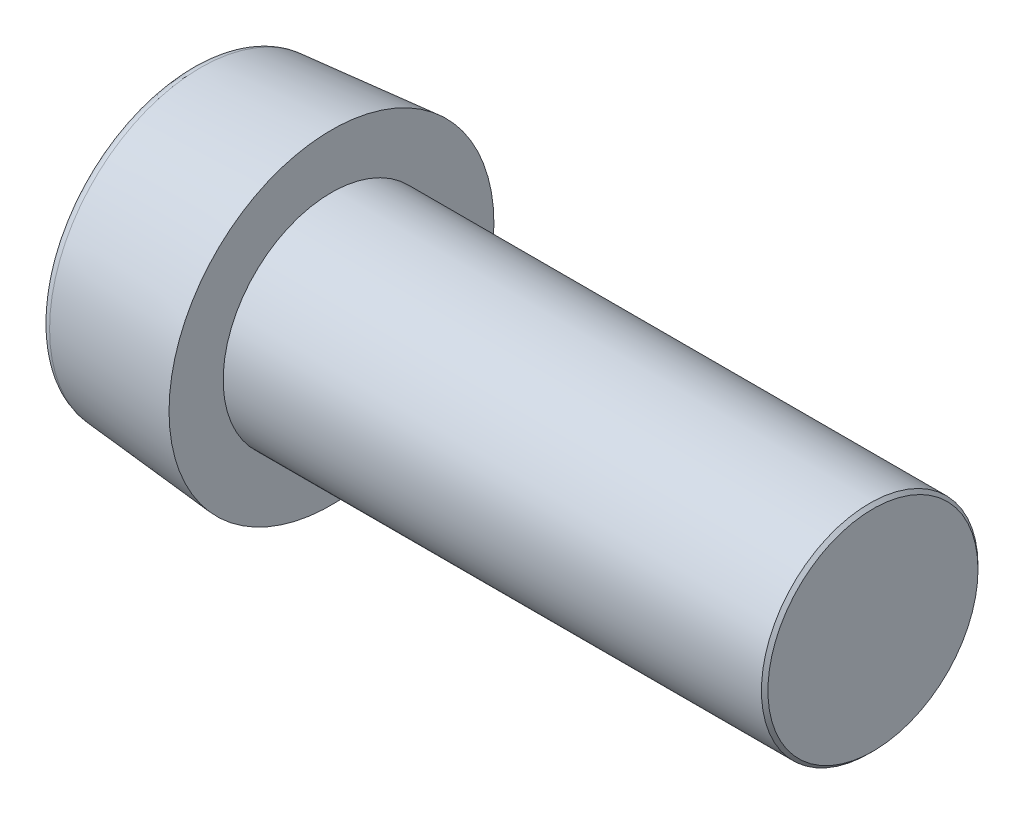
ISO-10303-21;
HEADER;
FILE_DESCRIPTION(('STEP AP214'),'2;1');
FILE_NAME('part.step','',(''),(''),'','','');
FILE_SCHEMA(('AUTOMOTIVE_DESIGN { 1 0 10303 214 1 1 1 1 }'));
ENDSEC;
DATA;
#1=APPLICATION_CONTEXT('core data for automotive mechanical design processes');
#2=APPLICATION_PROTOCOL_DEFINITION('international standard','automotive_design',2000,#1);
#3=PRODUCT_CONTEXT('',#1,'mechanical');
#4=PRODUCT('Part','Part','',(#3));
#5=PRODUCT_RELATED_PRODUCT_CATEGORY('part','',(#4));
#6=PRODUCT_DEFINITION_FORMATION('','',#4);
#7=PRODUCT_DEFINITION_CONTEXT('part definition',#1,'design');
#8=PRODUCT_DEFINITION('design','',#6,#7);
#9=PRODUCT_DEFINITION_SHAPE('','',#8);
#10=(LENGTH_UNIT() NAMED_UNIT(*) SI_UNIT(.MILLI.,.METRE.));
#11=(NAMED_UNIT(*) PLANE_ANGLE_UNIT() SI_UNIT($,.RADIAN.));
#12=(NAMED_UNIT(*) SI_UNIT($,.STERADIAN.) SOLID_ANGLE_UNIT());
#13=UNCERTAINTY_MEASURE_WITH_UNIT(LENGTH_MEASURE(1.E-05),#10,'distance_accuracy_value','');
#14=(GEOMETRIC_REPRESENTATION_CONTEXT(3) GLOBAL_UNCERTAINTY_ASSIGNED_CONTEXT((#13)) GLOBAL_UNIT_ASSIGNED_CONTEXT((#10,
#11,#12)) REPRESENTATION_CONTEXT('',''));
#15=CARTESIAN_POINT('',(0.,0.,0.));
#16=DIRECTION('',(0.,0.,1.));
#17=DIRECTION('',(1.,0.,0.));
#18=AXIS2_PLACEMENT_3D('',#15,#16,#17);
#19=CARTESIAN_POINT('',(-11.3282161267859,-3.48910775284139,-2.14278380347821));
#20=DIRECTION('',(1.,0.,0.));
#21=DIRECTION('',(0.,0.,-1.));
#22=AXIS2_PLACEMENT_3D('',#19,#20,#21);
#23=PLANE('',#22);
#24=CARTESIAN_POINT('',(-11.3282161267859,-3.48910775284139,-2.14278380347821));
#25=DIRECTION('',(1.,0.,0.));
#26=DIRECTION('',(0.,0.,-1.));
#27=AXIS2_PLACEMENT_3D('',#24,#25,#26);
#28=CIRCLE('',#27,12.9463162001456);
#29=CARTESIAN_POINT('',(-11.3282161267859,-3.48910775284139,-15.0891000036238));
#30=VERTEX_POINT('',#29);
#31=EDGE_CURVE('E113',#30,#30,#28,.F.);
#32=ORIENTED_EDGE('',*,*,#31,.T.);
#33=EDGE_LOOP('',(#32));
#34=FACE_BOUND('',#33,.T.);
#35=DIRECTION('',(0.,0.866025403784439,-0.5));
#36=VECTOR('',#35,1.);
#37=CARTESIAN_POINT('',(-11.3282161267859,-9.98910775284139,-5.89556055321078));
#38=LINE('',#37,#36);
#39=CARTESIAN_POINT('',(-11.3282161267859,-9.98910775284139,-5.89556055321078));
#40=VERTEX_POINT('',#39);
#41=CARTESIAN_POINT('',(-11.3282161267859,-3.48910775284139,-9.64833730294335));
#42=VERTEX_POINT('',#41);
#43=EDGE_CURVE('E33',#40,#42,#38,.T.);
#44=ORIENTED_EDGE('',*,*,#43,.T.);
#45=DIRECTION('',(0.,0.866025403784439,0.5));
#46=VECTOR('',#45,1.);
#47=CARTESIAN_POINT('',(-11.3282161267859,-3.48910775284139,-9.64833730294335));
#48=LINE('',#47,#46);
#49=CARTESIAN_POINT('',(-11.3282161267859,3.01089224715861,-5.89556055321078));
#50=VERTEX_POINT('',#49);
#51=EDGE_CURVE('E89',#42,#50,#48,.T.);
#52=ORIENTED_EDGE('',*,*,#51,.T.);
#53=DIRECTION('',(0.,0.,1.));
#54=VECTOR('',#53,1.);
#55=CARTESIAN_POINT('',(-11.3282161267859,3.01089224715861,-5.89556055321078));
#56=LINE('',#55,#54);
#57=CARTESIAN_POINT('',(-11.3282161267859,3.01089224715861,1.60999294625436));
#58=VERTEX_POINT('',#57);
#59=EDGE_CURVE('E86',#50,#58,#56,.T.);
#60=ORIENTED_EDGE('',*,*,#59,.T.);
#61=DIRECTION('',(0.,-0.866025403784438,0.5));
#62=VECTOR('',#61,1.);
#63=CARTESIAN_POINT('',(-11.3282161267859,3.01089224715861,1.60999294625436));
#64=LINE('',#63,#62);
#65=CARTESIAN_POINT('',(-11.3282161267859,-3.48910775284139,5.36276969598693));
#66=VERTEX_POINT('',#65);
#67=EDGE_CURVE('E66',#58,#66,#64,.T.);
#68=ORIENTED_EDGE('',*,*,#67,.T.);
#69=DIRECTION('',(0.,-0.866025403784438,-0.5));
#70=VECTOR('',#69,1.);
#71=CARTESIAN_POINT('',(-11.3282161267859,-3.48910775284139,5.36276969598693));
#72=LINE('',#71,#70);
#73=CARTESIAN_POINT('',(-11.3282161267859,-9.98910775284139,1.60999294625436));
#74=VERTEX_POINT('',#73);
#75=EDGE_CURVE('E77',#66,#74,#72,.T.);
#76=ORIENTED_EDGE('',*,*,#75,.T.);
#77=DIRECTION('',(0.,0.,-1.));
#78=VECTOR('',#77,1.);
#79=CARTESIAN_POINT('',(-11.3282161267859,-9.98910775284139,1.60999294625436));
#80=LINE('',#79,#78);
#81=EDGE_CURVE('E81',#74,#40,#80,.T.);
#82=ORIENTED_EDGE('',*,*,#81,.T.);
#83=EDGE_LOOP('',(#44,#52,#60,#68,#76,#82));
#84=FACE_BOUND('',#83,.T.);
#85=ADVANCED_FACE('F16',(#34,#84),#23,.F.);
#86=CARTESIAN_POINT('',(1.6717838732141,-3.48910775284139,-2.14278380347821));
#87=DIRECTION('',(1.,0.,0.));
#88=DIRECTION('',(0.,0.,-1.));
#89=AXIS2_PLACEMENT_3D('',#86,#87,#88);
#90=PLANE('',#89);
#91=CARTESIAN_POINT('',(1.6717838732141,-3.48910775284139,-2.14278380347821));
#92=DIRECTION('',(1.,0.,0.));
#93=DIRECTION('',(0.,0.,-1.));
#94=AXIS2_PLACEMENT_3D('',#91,#92,#93);
#95=CIRCLE('',#94,15.);
#96=CARTESIAN_POINT('',(1.6717838732141,-3.48910775284139,-17.1427838034782));
#97=VERTEX_POINT('',#96);
#98=EDGE_CURVE('E107',#97,#97,#95,.T.);
#99=ORIENTED_EDGE('',*,*,#98,.T.);
#100=EDGE_LOOP('',(#99));
#101=FACE_BOUND('',#100,.T.);
#102=CARTESIAN_POINT('',(1.6717838732141,-3.48910775284139,-2.14278380347821));
#103=DIRECTION('',(1.,0.,0.));
#104=DIRECTION('',(0.,0.,-1.));
#105=AXIS2_PLACEMENT_3D('',#102,#103,#104);
#106=CIRCLE('',#105,10.);
#107=CARTESIAN_POINT('',(1.6717838732141,-3.48910775284139,-12.1427838034782));
#108=VERTEX_POINT('',#107);
#109=EDGE_CURVE('E104',#108,#108,#106,.T.);
#110=ORIENTED_EDGE('',*,*,#109,.F.);
#111=EDGE_LOOP('',(#110));
#112=FACE_BOUND('',#111,.T.);
#113=ADVANCED_FACE('F132',(#101,#112),#90,.T.);
#114=CARTESIAN_POINT('',(1.6717838732141,-3.48910775284139,-2.14278380347821));
#115=DIRECTION('',(1.,0.,0.));
#116=DIRECTION('',(0.,0.,-1.));
#117=AXIS2_PLACEMENT_3D('',#114,#115,#116);
#118=CONICAL_SURFACE('',#117,15.,0.0872664625997167);
#119=CARTESIAN_POINT('',(-10.4153718695336,-3.48910775284139,-2.14278380347821));
#120=DIRECTION('',(1.,0.,0.));
#121=DIRECTION('',(0.,0.,-1.));
#122=AXIS2_PLACEMENT_3D('',#119,#120,#121);
#123=CIRCLE('',#122,13.9425108982373);
#124=CARTESIAN_POINT('',(-10.4153718695336,-3.48910775284139,-16.0852947017155));
#125=VERTEX_POINT('',#124);
#126=EDGE_CURVE('E115',#125,#125,#123,.T.);
#127=ORIENTED_EDGE('',*,*,#126,.T.);
#128=EDGE_LOOP('',(#127));
#129=FACE_BOUND('',#128,.T.);
#130=ORIENTED_EDGE('',*,*,#98,.F.);
#131=EDGE_LOOP('',(#130));
#132=FACE_BOUND('',#131,.T.);
#133=ADVANCED_FACE('F136',(#129,#132),#118,.T.);
#134=CARTESIAN_POINT('',(51.6717838732141,-3.48910775284139,-2.14278380347821));
#135=DIRECTION('',(-1.,0.,0.));
#136=DIRECTION('',(0.,0.,1.));
#137=AXIS2_PLACEMENT_3D('',#134,#135,#136);
#138=CYLINDRICAL_SURFACE('',#137,10.);
#139=CARTESIAN_POINT('',(51.3717838732141,-3.48910775284139,-2.14278380347821));
#140=DIRECTION('',(1.,0.,0.));
#141=DIRECTION('',(0.,0.,-1.));
#142=AXIS2_PLACEMENT_3D('',#139,#140,#141);
#143=CIRCLE('',#142,10.);
#144=CARTESIAN_POINT('',(51.3717838732141,-3.48910775284139,-12.1427838034782));
#145=VERTEX_POINT('',#144);
#146=EDGE_CURVE('E10',#145,#145,#143,.F.);
#147=ORIENTED_EDGE('',*,*,#146,.T.);
#148=EDGE_LOOP('',(#147));
#149=FACE_BOUND('',#148,.T.);
#150=ORIENTED_EDGE('',*,*,#109,.T.);
#151=EDGE_LOOP('',(#150));
#152=FACE_BOUND('',#151,.T.);
#153=ADVANCED_FACE('F141',(#149,#152),#138,.T.);
#154=CARTESIAN_POINT('',(51.6717838732141,-3.48910775284139,-2.14278380347821));
#155=DIRECTION('',(1.,0.,0.));
#156=DIRECTION('',(0.,0.,-1.));
#157=AXIS2_PLACEMENT_3D('',#154,#155,#156);
#158=PLANE('',#157);
#159=CARTESIAN_POINT('',(51.6717838732141,-3.48910775284139,-2.14278380347821));
#160=DIRECTION('',(1.,0.,0.));
#161=DIRECTION('',(0.,0.,-1.));
#162=AXIS2_PLACEMENT_3D('',#159,#160,#161);
#163=CIRCLE('',#162,9.70000000000001);
#164=CARTESIAN_POINT('',(51.6717838732141,-3.48910775284139,-11.8427838034782));
#165=VERTEX_POINT('',#164);
#166=EDGE_CURVE('E24',#165,#165,#163,.T.);
#167=ORIENTED_EDGE('',*,*,#166,.T.);
#168=EDGE_LOOP('',(#167));
#169=FACE_BOUND('',#168,.T.);
#170=ADVANCED_FACE('F120',(#169),#158,.T.);
#171=CARTESIAN_POINT('',(-4.3282161267859,-9.98910775284139,-5.89556055321078));
#172=DIRECTION('',(0.,0.5,0.866025403784439));
#173=DIRECTION('',(0.,-0.866025403784439,0.5));
#174=AXIS2_PLACEMENT_3D('',#171,#172,#173);
#175=PLANE('',#174);
#176=ORIENTED_EDGE('',*,*,#43,.F.);
#177=DIRECTION('',(-1.,0.,0.));
#178=VECTOR('',#177,1.);
#179=CARTESIAN_POINT('',(-4.3282161267859,-9.98910775284139,-5.89556055321078));
#180=LINE('',#179,#178);
#181=CARTESIAN_POINT('',(-4.3282161267859,-9.98910775284139,-5.89556055321078));
#182=VERTEX_POINT('',#181);
#183=EDGE_CURVE('E96',#182,#40,#180,.T.);
#184=ORIENTED_EDGE('',*,*,#183,.F.);
#185=DIRECTION('',(0.,0.866025403784439,-0.5));
#186=VECTOR('',#185,1.);
#187=CARTESIAN_POINT('',(-4.3282161267859,-9.98910775284139,-5.89556055321078));
#188=LINE('',#187,#186);
#189=CARTESIAN_POINT('',(-4.3282161267859,-3.48910775284139,-9.64833730294335));
#190=VERTEX_POINT('',#189);
#191=EDGE_CURVE('E92',#182,#190,#188,.T.);
#192=ORIENTED_EDGE('',*,*,#191,.T.);
#193=DIRECTION('',(-1.,0.,0.));
#194=VECTOR('',#193,1.);
#195=CARTESIAN_POINT('',(-4.3282161267859,-3.48910775284139,-9.64833730294335));
#196=LINE('',#195,#194);
#197=EDGE_CURVE('E103',#190,#42,#196,.T.);
#198=ORIENTED_EDGE('',*,*,#197,.T.);
#199=EDGE_LOOP('',(#176,#184,#192,#198));
#200=FACE_BOUND('',#199,.T.);
#201=ADVANCED_FACE('F165',(#200),#175,.T.);
#202=CARTESIAN_POINT('',(-4.3282161267859,-3.48910775284139,-9.64833730294335));
#203=DIRECTION('',(0.,-0.5,0.866025403784438));
#204=DIRECTION('',(0.,-0.866025403784439,-0.5));
#205=AXIS2_PLACEMENT_3D('',#202,#203,#204);
#206=PLANE('',#205);
#207=ORIENTED_EDGE('',*,*,#51,.F.);
#208=ORIENTED_EDGE('',*,*,#197,.F.);
#209=DIRECTION('',(0.,0.866025403784439,0.5));
#210=VECTOR('',#209,1.);
#211=CARTESIAN_POINT('',(-4.3282161267859,-3.48910775284139,-9.64833730294335));
#212=LINE('',#211,#210);
#213=CARTESIAN_POINT('',(-4.3282161267859,3.01089224715861,-5.89556055321078));
#214=VERTEX_POINT('',#213);
#215=EDGE_CURVE('E232',#190,#214,#212,.T.);
#216=ORIENTED_EDGE('',*,*,#215,.T.);
#217=DIRECTION('',(-1.,0.,0.));
#218=VECTOR('',#217,1.);
#219=CARTESIAN_POINT('',(-4.3282161267859,3.01089224715861,-5.89556055321078));
#220=LINE('',#219,#218);
#221=EDGE_CURVE('E101',#214,#50,#220,.T.);
#222=ORIENTED_EDGE('',*,*,#221,.T.);
#223=EDGE_LOOP('',(#207,#208,#216,#222));
#224=FACE_BOUND('',#223,.T.);
#225=ADVANCED_FACE('F167',(#224),#206,.T.);
#226=CARTESIAN_POINT('',(-4.3282161267859,3.01089224715861,-5.89556055321078));
#227=DIRECTION('',(0.,-1.,0.));
#228=DIRECTION('',(0.,0.,-1.));
#229=AXIS2_PLACEMENT_3D('',#226,#227,#228);
#230=PLANE('',#229);
#231=ORIENTED_EDGE('',*,*,#59,.F.);
#232=ORIENTED_EDGE('',*,*,#221,.F.);
#233=DIRECTION('',(0.,0.,1.));
#234=VECTOR('',#233,1.);
#235=CARTESIAN_POINT('',(-4.3282161267859,3.01089224715861,-5.89556055321078));
#236=LINE('',#235,#234);
#237=CARTESIAN_POINT('',(-4.3282161267859,3.01089224715861,1.60999294625436));
#238=VERTEX_POINT('',#237);
#239=EDGE_CURVE('E37',#214,#238,#236,.T.);
#240=ORIENTED_EDGE('',*,*,#239,.T.);
#241=DIRECTION('',(-1.,0.,0.));
#242=VECTOR('',#241,1.);
#243=CARTESIAN_POINT('',(-4.3282161267859,3.01089224715861,1.60999294625436));
#244=LINE('',#243,#242);
#245=EDGE_CURVE('E72',#238,#58,#244,.T.);
#246=ORIENTED_EDGE('',*,*,#245,.T.);
#247=EDGE_LOOP('',(#231,#232,#240,#246));
#248=FACE_BOUND('',#247,.T.);
#249=ADVANCED_FACE('F171',(#248),#230,.T.);
#250=CARTESIAN_POINT('',(-4.3282161267859,3.01089224715861,1.60999294625436));
#251=DIRECTION('',(0.,-0.5,-0.866025403784438));
#252=DIRECTION('',(0.,0.866025403784439,-0.5));
#253=AXIS2_PLACEMENT_3D('',#250,#251,#252);
#254=PLANE('',#253);
#255=ORIENTED_EDGE('',*,*,#67,.F.);
#256=ORIENTED_EDGE('',*,*,#245,.F.);
#257=DIRECTION('',(0.,-0.866025403784438,0.5));
#258=VECTOR('',#257,1.);
#259=CARTESIAN_POINT('',(-4.3282161267859,3.01089224715861,1.60999294625436));
#260=LINE('',#259,#258);
#261=CARTESIAN_POINT('',(-4.3282161267859,-3.48910775284139,5.36276969598693));
#262=VERTEX_POINT('',#261);
#263=EDGE_CURVE('E75',#238,#262,#260,.T.);
#264=ORIENTED_EDGE('',*,*,#263,.T.);
#265=DIRECTION('',(-1.,0.,0.));
#266=VECTOR('',#265,1.);
#267=CARTESIAN_POINT('',(-4.3282161267859,-3.48910775284139,5.36276969598693));
#268=LINE('',#267,#266);
#269=EDGE_CURVE('E62',#262,#66,#268,.T.);
#270=ORIENTED_EDGE('',*,*,#269,.T.);
#271=EDGE_LOOP('',(#255,#256,#264,#270));
#272=FACE_BOUND('',#271,.T.);
#273=ADVANCED_FACE('F63',(#272),#254,.T.);
#274=CARTESIAN_POINT('',(-4.3282161267859,-3.48910775284139,5.36276969598693));
#275=DIRECTION('',(0.,0.5,-0.866025403784438));
#276=DIRECTION('',(0.,0.866025403784439,0.5));
#277=AXIS2_PLACEMENT_3D('',#274,#275,#276);
#278=PLANE('',#277);
#279=ORIENTED_EDGE('',*,*,#75,.F.);
#280=ORIENTED_EDGE('',*,*,#269,.F.);
#281=DIRECTION('',(0.,-0.866025403784438,-0.5));
#282=VECTOR('',#281,1.);
#283=CARTESIAN_POINT('',(-4.3282161267859,-3.48910775284139,5.36276969598693));
#284=LINE('',#283,#282);
#285=CARTESIAN_POINT('',(-4.3282161267859,-9.98910775284139,1.60999294625436));
#286=VERTEX_POINT('',#285);
#287=EDGE_CURVE('E209',#262,#286,#284,.T.);
#288=ORIENTED_EDGE('',*,*,#287,.T.);
#289=DIRECTION('',(-1.,0.,0.));
#290=VECTOR('',#289,1.);
#291=CARTESIAN_POINT('',(-4.3282161267859,-9.98910775284139,1.60999294625436));
#292=LINE('',#291,#290);
#293=EDGE_CURVE('E74',#286,#74,#292,.T.);
#294=ORIENTED_EDGE('',*,*,#293,.T.);
#295=EDGE_LOOP('',(#279,#280,#288,#294));
#296=FACE_BOUND('',#295,.T.);
#297=ADVANCED_FACE('F78',(#296),#278,.T.);
#298=CARTESIAN_POINT('',(-4.3282161267859,-9.98910775284139,1.60999294625436));
#299=DIRECTION('',(0.,1.,0.));
#300=DIRECTION('',(0.,0.,1.));
#301=AXIS2_PLACEMENT_3D('',#298,#299,#300);
#302=PLANE('',#301);
#303=ORIENTED_EDGE('',*,*,#81,.F.);
#304=ORIENTED_EDGE('',*,*,#293,.F.);
#305=DIRECTION('',(0.,0.,-1.));
#306=VECTOR('',#305,1.);
#307=CARTESIAN_POINT('',(-4.3282161267859,-9.98910775284139,1.60999294625436));
#308=LINE('',#307,#306);
#309=EDGE_CURVE('E98',#286,#182,#308,.T.);
#310=ORIENTED_EDGE('',*,*,#309,.T.);
#311=ORIENTED_EDGE('',*,*,#183,.T.);
#312=EDGE_LOOP('',(#303,#304,#310,#311));
#313=FACE_BOUND('',#312,.T.);
#314=ADVANCED_FACE('F177',(#313),#302,.T.);
#315=CARTESIAN_POINT('',(-4.3282161267859,-3.48910775284139,5.36276969598693));
#316=DIRECTION('',(0.86602540378444,-0.249999999999999,0.433012701892218));
#317=DIRECTION('',(0.447213595499956,0.,-0.894427190999917));
#318=AXIS2_PLACEMENT_3D('',#315,#316,#317);
#319=PLANE('',#318);
#320=ORIENTED_EDGE('',*,*,#287,.F.);
#321=DIRECTION('',(-0.447213595499956,0.,0.894427190999917));
#322=VECTOR('',#321,1.);
#323=CARTESIAN_POINT('',(-4.3282161267859,-3.48910775284139,5.36276969598693));
#324=LINE('',#323,#322);
#325=CARTESIAN_POINT('',(-0.575439377053354,-3.48910775284139,-2.14278380347821));
#326=VERTEX_POINT('',#325);
#327=EDGE_CURVE('E215',#326,#262,#324,.T.);
#328=ORIENTED_EDGE('',*,*,#327,.F.);
#329=DIRECTION('',(-0.447213595499956,-0.774596669241484,0.447213595499958));
#330=VECTOR('',#329,1.);
#331=CARTESIAN_POINT('',(-4.3282161267859,-9.98910775284139,1.60999294625436));
#332=LINE('',#331,#330);
#333=EDGE_CURVE('E214',#326,#286,#332,.T.);
#334=ORIENTED_EDGE('',*,*,#333,.T.);
#335=EDGE_LOOP('',(#320,#328,#334));
#336=FACE_BOUND('',#335,.T.);
#337=ADVANCED_FACE('F183',(#336),#319,.F.);
#338=CARTESIAN_POINT('',(-4.3282161267859,-9.98910775284139,1.60999294625436));
#339=DIRECTION('',(0.86602540378444,-0.499999999999998,0.));
#340=DIRECTION('',(0.499999999999998,0.86602540378444,0.));
#341=AXIS2_PLACEMENT_3D('',#338,#339,#340);
#342=PLANE('',#341);
#343=ORIENTED_EDGE('',*,*,#309,.F.);
#344=ORIENTED_EDGE('',*,*,#333,.F.);
#345=DIRECTION('',(-0.447213595499956,-0.774596669241484,-0.447213595499958));
#346=VECTOR('',#345,1.);
#347=CARTESIAN_POINT('',(-4.3282161267859,-9.98910775284139,-5.89556055321078));
#348=LINE('',#347,#346);
#349=EDGE_CURVE('E237',#326,#182,#348,.T.);
#350=ORIENTED_EDGE('',*,*,#349,.T.);
#351=EDGE_LOOP('',(#343,#344,#350));
#352=FACE_BOUND('',#351,.T.);
#353=ADVANCED_FACE('F184',(#352),#342,.F.);
#354=CARTESIAN_POINT('',(-4.3282161267859,-9.98910775284139,-5.89556055321078));
#355=DIRECTION('',(0.86602540378444,-0.249999999999999,-0.433012701892218));
#356=DIRECTION('',(-0.447213595499956,0.,-0.894427190999917));
#357=AXIS2_PLACEMENT_3D('',#354,#355,#356);
#358=PLANE('',#357);
#359=ORIENTED_EDGE('',*,*,#191,.F.);
#360=ORIENTED_EDGE('',*,*,#349,.F.);
#361=DIRECTION('',(-0.447213595499956,0.,-0.894427190999917));
#362=VECTOR('',#361,1.);
#363=CARTESIAN_POINT('',(-4.3282161267859,-3.48910775284139,-9.64833730294335));
#364=LINE('',#363,#362);
#365=EDGE_CURVE('E250',#326,#190,#364,.T.);
#366=ORIENTED_EDGE('',*,*,#365,.T.);
#367=EDGE_LOOP('',(#359,#360,#366));
#368=FACE_BOUND('',#367,.T.);
#369=ADVANCED_FACE('F187',(#368),#358,.F.);
#370=CARTESIAN_POINT('',(-4.3282161267859,-3.48910775284139,-9.64833730294335));
#371=DIRECTION('',(0.86602540378444,0.249999999999999,-0.433012701892218));
#372=DIRECTION('',(-0.447213595499956,0.,-0.894427190999917));
#373=AXIS2_PLACEMENT_3D('',#370,#371,#372);
#374=PLANE('',#373);
#375=ORIENTED_EDGE('',*,*,#215,.F.);
#376=ORIENTED_EDGE('',*,*,#365,.F.);
#377=DIRECTION('',(-0.447213595499956,0.774596669241484,-0.447213595499958));
#378=VECTOR('',#377,1.);
#379=CARTESIAN_POINT('',(-4.3282161267859,3.01089224715861,-5.89556055321078));
#380=LINE('',#379,#378);
#381=EDGE_CURVE('E246',#326,#214,#380,.T.);
#382=ORIENTED_EDGE('',*,*,#381,.T.);
#383=EDGE_LOOP('',(#375,#376,#382));
#384=FACE_BOUND('',#383,.T.);
#385=ADVANCED_FACE('F195',(#384),#374,.F.);
#386=CARTESIAN_POINT('',(-4.3282161267859,3.01089224715861,-5.89556055321078));
#387=DIRECTION('',(0.86602540378444,0.499999999999998,0.));
#388=DIRECTION('',(-0.499999999999998,0.86602540378444,0.));
#389=AXIS2_PLACEMENT_3D('',#386,#387,#388);
#390=PLANE('',#389);
#391=ORIENTED_EDGE('',*,*,#239,.F.);
#392=ORIENTED_EDGE('',*,*,#381,.F.);
#393=DIRECTION('',(-0.447213595499956,0.774596669241484,0.447213595499958));
#394=VECTOR('',#393,1.);
#395=CARTESIAN_POINT('',(-4.3282161267859,3.01089224715861,1.60999294625436));
#396=LINE('',#395,#394);
#397=EDGE_CURVE('E242',#326,#238,#396,.T.);
#398=ORIENTED_EDGE('',*,*,#397,.T.);
#399=EDGE_LOOP('',(#391,#392,#398));
#400=FACE_BOUND('',#399,.T.);
#401=ADVANCED_FACE('F198',(#400),#390,.F.);
#402=CARTESIAN_POINT('',(-4.3282161267859,3.01089224715861,1.60999294625436));
#403=DIRECTION('',(0.86602540378444,0.249999999999999,0.433012701892218));
#404=DIRECTION('',(0.447213595499956,0.,-0.894427190999917));
#405=AXIS2_PLACEMENT_3D('',#402,#403,#404);
#406=PLANE('',#405);
#407=ORIENTED_EDGE('',*,*,#263,.F.);
#408=ORIENTED_EDGE('',*,*,#397,.F.);
#409=ORIENTED_EDGE('',*,*,#327,.T.);
#410=EDGE_LOOP('',(#407,#408,#409));
#411=FACE_BOUND('',#410,.T.);
#412=ADVANCED_FACE('F127',(#411),#406,.F.);
#413=CARTESIAN_POINT('',(-10.3282161267859,-3.48910775284139,-2.14278380347821));
#414=DIRECTION('',(1.,0.,0.));
#415=DIRECTION('',(0.,0.,-1.));
#416=AXIS2_PLACEMENT_3D('',#413,#414,#415);
#417=TOROIDAL_SURFACE('',#416,12.9463162001456,1.);
#418=ORIENTED_EDGE('',*,*,#31,.F.);
#419=EDGE_LOOP('',(#418));
#420=FACE_BOUND('',#419,.T.);
#421=ORIENTED_EDGE('',*,*,#126,.F.);
#422=EDGE_LOOP('',(#421));
#423=FACE_BOUND('',#422,.T.);
#424=ADVANCED_FACE('F125',(#420,#423),#417,.T.);
#425=CARTESIAN_POINT('',(51.6717838732141,-3.48910775284139,-2.14278380347821));
#426=DIRECTION('',(-1.,0.,0.));
#427=DIRECTION('',(0.,0.,1.));
#428=AXIS2_PLACEMENT_3D('',#425,#426,#427);
#429=CONICAL_SURFACE('',#428,9.70000000000001,0.785398163397422);
#430=ORIENTED_EDGE('',*,*,#146,.F.);
#431=EDGE_LOOP('',(#430));
#432=FACE_BOUND('',#431,.T.);
#433=ORIENTED_EDGE('',*,*,#166,.F.);
#434=EDGE_LOOP('',(#433));
#435=FACE_BOUND('',#434,.T.);
#436=ADVANCED_FACE('F18',(#432,#435),#429,.T.);
#437=CLOSED_SHELL('',(#85,#113,#133,#153,#170,#201,#225,#249,#273,#297,#314,#337,#353,#369,#385,
#401,#412,#424,#436));
#438=MANIFOLD_SOLID_BREP('B1',#437);
#439=ADVANCED_BREP_SHAPE_REPRESENTATION('',(#18,#438),#14);
#440=SHAPE_DEFINITION_REPRESENTATION(#9,#439);
ENDSEC;
END-ISO-10303-21;
